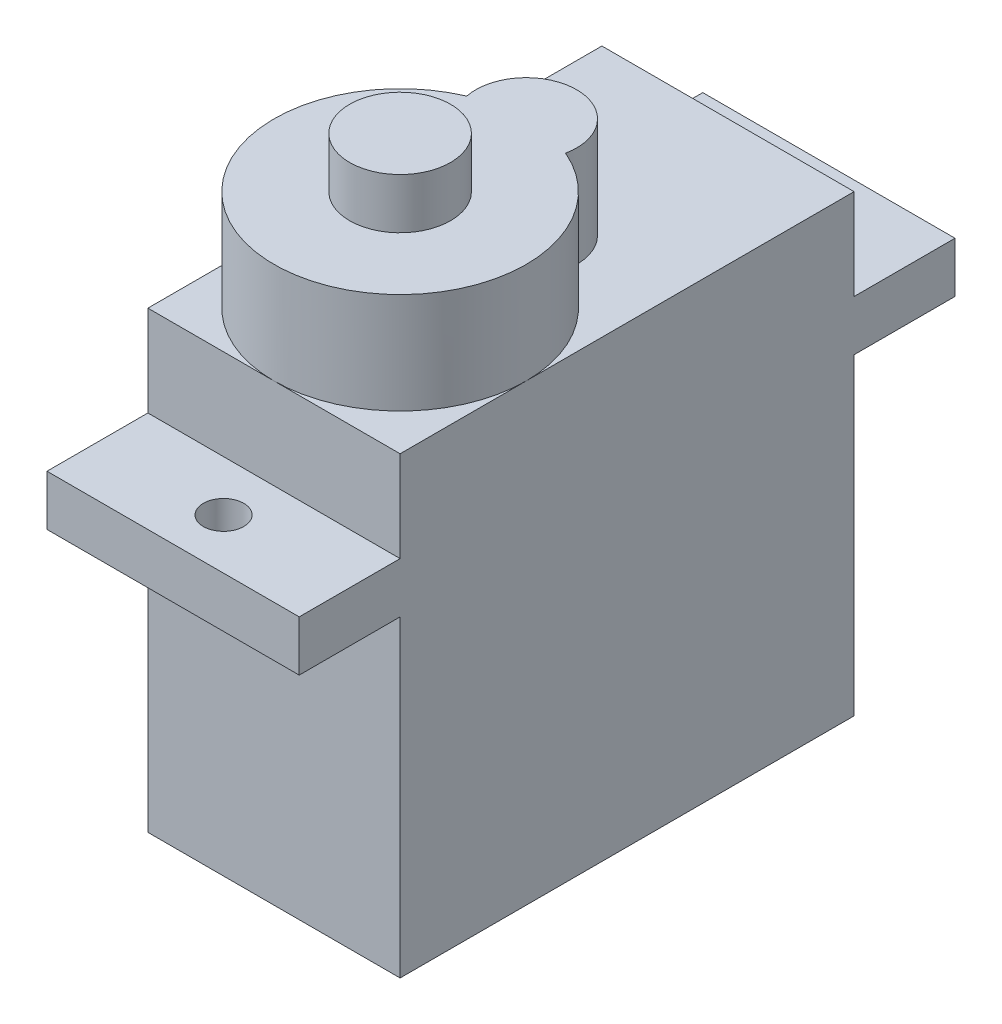
ISO-10303-21;
HEADER;
FILE_DESCRIPTION(('STEP AP214'),'2;1');
FILE_NAME('part.step','',(''),(''),'','','');
FILE_SCHEMA(('AUTOMOTIVE_DESIGN { 1 0 10303 214 1 1 1 1 }'));
ENDSEC;
DATA;
#1=APPLICATION_CONTEXT('core data for automotive mechanical design processes');
#2=APPLICATION_PROTOCOL_DEFINITION('international standard','automotive_design',2000,#1);
#3=PRODUCT_CONTEXT('',#1,'mechanical');
#4=PRODUCT('Part','Part','',(#3));
#5=PRODUCT_RELATED_PRODUCT_CATEGORY('part','',(#4));
#6=PRODUCT_DEFINITION_FORMATION('','',#4);
#7=PRODUCT_DEFINITION_CONTEXT('part definition',#1,'design');
#8=PRODUCT_DEFINITION('design','',#6,#7);
#9=PRODUCT_DEFINITION_SHAPE('','',#8);
#10=(LENGTH_UNIT() NAMED_UNIT(*) SI_UNIT(.MILLI.,.METRE.));
#11=(NAMED_UNIT(*) PLANE_ANGLE_UNIT() SI_UNIT($,.RADIAN.));
#12=(NAMED_UNIT(*) SI_UNIT($,.STERADIAN.) SOLID_ANGLE_UNIT());
#13=UNCERTAINTY_MEASURE_WITH_UNIT(LENGTH_MEASURE(1.E-05),#10,'distance_accuracy_value','');
#14=(GEOMETRIC_REPRESENTATION_CONTEXT(3) GLOBAL_UNCERTAINTY_ASSIGNED_CONTEXT((#13)) GLOBAL_UNIT_ASSIGNED_CONTEXT((#10,
#11,#12)) REPRESENTATION_CONTEXT('',''));
#15=CARTESIAN_POINT('',(0.,0.,0.));
#16=DIRECTION('',(0.,0.,1.));
#17=DIRECTION('',(1.,0.,0.));
#18=AXIS2_PLACEMENT_3D('',#15,#16,#17);
#19=CARTESIAN_POINT('',(6.25,27.5,13.125));
#20=DIRECTION('',(0.,1.,0.));
#21=DIRECTION('',(0.,0.,1.));
#22=AXIS2_PLACEMENT_3D('',#19,#20,#21);
#23=PLANE('',#22);
#24=CARTESIAN_POINT('',(6.25,27.5,10.));
#25=DIRECTION('',(0.,1.,0.));
#26=DIRECTION('',(0.,0.,1.));
#27=AXIS2_PLACEMENT_3D('',#24,#25,#26);
#28=CIRCLE('',#27,2.5);
#29=CARTESIAN_POINT('',(8.69948974278318,27.5,10.5));
#30=VERTEX_POINT('',#29);
#31=CARTESIAN_POINT('',(3.80051025721682,27.5,10.5));
#32=VERTEX_POINT('',#31);
#33=EDGE_CURVE('E155',#30,#32,#28,.T.);
#34=ORIENTED_EDGE('',*,*,#33,.T.);
#35=CARTESIAN_POINT('',(6.25,27.5,16.25));
#36=DIRECTION('',(0.,1.,0.));
#37=DIRECTION('',(0.,0.,1.));
#38=AXIS2_PLACEMENT_3D('',#35,#36,#37);
#39=CIRCLE('',#38,6.25);
#40=EDGE_CURVE('E145',#32,#30,#39,.T.);
#41=ORIENTED_EDGE('',*,*,#40,.T.);
#42=EDGE_LOOP('',(#34,#41));
#43=FACE_BOUND('',#42,.T.);
#44=CARTESIAN_POINT('',(6.25,27.5,16.25));
#45=DIRECTION('',(0.,1.,0.));
#46=DIRECTION('',(0.,0.,1.));
#47=AXIS2_PLACEMENT_3D('',#44,#45,#46);
#48=CIRCLE('',#47,2.5);
#49=CARTESIAN_POINT('',(6.25,27.5,18.75));
#50=VERTEX_POINT('',#49);
#51=EDGE_CURVE('E261',#50,#50,#48,.T.);
#52=ORIENTED_EDGE('',*,*,#51,.F.);
#53=EDGE_LOOP('',(#52));
#54=FACE_BOUND('',#53,.T.);
#55=ADVANCED_FACE('F34',(#43,#54),#23,.T.);
#56=CARTESIAN_POINT('',(0.,22.5,22.5));
#57=DIRECTION('',(0.,-1.,0.));
#58=DIRECTION('',(0.,0.,-1.));
#59=AXIS2_PLACEMENT_3D('',#56,#57,#58);
#60=PLANE('',#59);
#61=CARTESIAN_POINT('',(6.25,22.5,10.));
#62=DIRECTION('',(0.,1.,0.));
#63=DIRECTION('',(0.,0.,1.));
#64=AXIS2_PLACEMENT_3D('',#61,#62,#63);
#65=CIRCLE('',#64,2.5);
#66=CARTESIAN_POINT('',(8.69948974278318,22.5,10.5));
#67=VERTEX_POINT('',#66);
#68=CARTESIAN_POINT('',(3.80051025721682,22.5,10.5));
#69=VERTEX_POINT('',#68);
#70=EDGE_CURVE('E161',#67,#69,#65,.T.);
#71=ORIENTED_EDGE('',*,*,#70,.F.);
#72=CARTESIAN_POINT('',(6.25,22.5,16.25));
#73=DIRECTION('',(0.,1.,0.));
#74=DIRECTION('',(0.,0.,1.));
#75=AXIS2_PLACEMENT_3D('',#72,#73,#74);
#76=CIRCLE('',#75,6.25);
#77=CARTESIAN_POINT('',(12.5,22.5,16.25));
#78=VERTEX_POINT('',#77);
#79=EDGE_CURVE('E57',#78,#67,#76,.T.);
#80=ORIENTED_EDGE('',*,*,#79,.F.);
#81=DIRECTION('',(0.,0.,-1.));
#82=VECTOR('',#81,1.);
#83=CARTESIAN_POINT('',(12.5,22.5,22.5));
#84=LINE('',#83,#82);
#85=CARTESIAN_POINT('',(12.5,22.5,0.));
#86=VERTEX_POINT('',#85);
#87=EDGE_CURVE('E242',#78,#86,#84,.T.);
#88=ORIENTED_EDGE('',*,*,#87,.T.);
#89=DIRECTION('',(-1.,0.,0.));
#90=VECTOR('',#89,1.);
#91=CARTESIAN_POINT('',(0.,22.5,0.));
#92=LINE('',#91,#90);
#93=CARTESIAN_POINT('',(0.,22.5,0.));
#94=VERTEX_POINT('',#93);
#95=EDGE_CURVE('E236',#86,#94,#92,.T.);
#96=ORIENTED_EDGE('',*,*,#95,.T.);
#97=DIRECTION('',(0.,0.,-1.));
#98=VECTOR('',#97,1.);
#99=CARTESIAN_POINT('',(0.,22.5,22.5));
#100=LINE('',#99,#98);
#101=CARTESIAN_POINT('',(0.,22.5,16.25));
#102=VERTEX_POINT('',#101);
#103=EDGE_CURVE('E226',#102,#94,#100,.T.);
#104=ORIENTED_EDGE('',*,*,#103,.F.);
#105=EDGE_CURVE('E45',#69,#102,#76,.T.);
#106=ORIENTED_EDGE('',*,*,#105,.F.);
#107=EDGE_LOOP('',(#71,#80,#88,#96,#104,#106));
#108=FACE_BOUND('',#107,.T.);
#109=ADVANCED_FACE('F326',(#108),#60,.F.);
#110=CARTESIAN_POINT('',(6.25,22.5,22.5));
#111=VERTEX_POINT('',#110);
#112=EDGE_CURVE('E11',#102,#111,#76,.T.);
#113=ORIENTED_EDGE('',*,*,#112,.F.);
#114=CARTESIAN_POINT('',(0.,22.5,22.5));
#115=VERTEX_POINT('',#114);
#116=EDGE_CURVE('E239',#115,#102,#100,.T.);
#117=ORIENTED_EDGE('',*,*,#116,.F.);
#118=DIRECTION('',(-1.,0.,0.));
#119=VECTOR('',#118,1.);
#120=CARTESIAN_POINT('',(0.,22.5,22.5));
#121=LINE('',#120,#119);
#122=EDGE_CURVE('E222',#111,#115,#121,.T.);
#123=ORIENTED_EDGE('',*,*,#122,.F.);
#124=EDGE_LOOP('',(#113,#117,#123));
#125=FACE_BOUND('',#124,.T.);
#126=ADVANCED_FACE('F324',(#125),#60,.F.);
#127=EDGE_CURVE('E43',#111,#78,#76,.T.);
#128=ORIENTED_EDGE('',*,*,#127,.F.);
#129=CARTESIAN_POINT('',(12.5,22.5,22.5));
#130=VERTEX_POINT('',#129);
#131=EDGE_CURVE('E223',#130,#111,#121,.T.);
#132=ORIENTED_EDGE('',*,*,#131,.F.);
#133=EDGE_CURVE('E243',#130,#78,#84,.T.);
#134=ORIENTED_EDGE('',*,*,#133,.T.);
#135=EDGE_LOOP('',(#128,#132,#134));
#136=FACE_BOUND('',#135,.T.);
#137=ADVANCED_FACE('F334',(#136),#60,.F.);
#138=CARTESIAN_POINT('',(0.,0.,22.5));
#139=DIRECTION('',(0.,0.,-1.));
#140=DIRECTION('',(-1.,0.,0.));
#141=AXIS2_PLACEMENT_3D('',#138,#139,#140);
#142=PLANE('',#141);
#143=DIRECTION('',(0.,-1.,0.));
#144=VECTOR('',#143,1.);
#145=CARTESIAN_POINT('',(0.,0.,22.5));
#146=LINE('',#145,#144);
#147=CARTESIAN_POINT('',(0.,18.,22.5));
#148=VERTEX_POINT('',#147);
#149=EDGE_CURVE('E212',#115,#148,#146,.T.);
#150=ORIENTED_EDGE('',*,*,#149,.T.);
#151=DIRECTION('',(1.,0.,0.));
#152=VECTOR('',#151,1.);
#153=CARTESIAN_POINT('',(0.,18.,22.5));
#154=LINE('',#153,#152);
#155=CARTESIAN_POINT('',(12.5,18.,22.5));
#156=VERTEX_POINT('',#155);
#157=EDGE_CURVE('E208',#148,#156,#154,.T.);
#158=ORIENTED_EDGE('',*,*,#157,.T.);
#159=DIRECTION('',(0.,1.,0.));
#160=VECTOR('',#159,1.);
#161=CARTESIAN_POINT('',(12.5,0.,22.5));
#162=LINE('',#161,#160);
#163=EDGE_CURVE('E218',#156,#130,#162,.T.);
#164=ORIENTED_EDGE('',*,*,#163,.T.);
#165=ORIENTED_EDGE('',*,*,#131,.T.);
#166=ORIENTED_EDGE('',*,*,#122,.T.);
#167=EDGE_LOOP('',(#150,#158,#164,#165,#166));
#168=FACE_BOUND('',#167,.T.);
#169=ADVANCED_FACE('F318',(#168),#142,.F.);
#170=CARTESIAN_POINT('',(0.,0.,0.));
#171=DIRECTION('',(0.,0.,-1.));
#172=DIRECTION('',(-1.,0.,0.));
#173=AXIS2_PLACEMENT_3D('',#170,#171,#172);
#174=PLANE('',#173);
#175=DIRECTION('',(1.,0.,0.));
#176=VECTOR('',#175,1.);
#177=CARTESIAN_POINT('',(0.,18.,0.));
#178=LINE('',#177,#176);
#179=CARTESIAN_POINT('',(0.,18.,0.));
#180=VERTEX_POINT('',#179);
#181=CARTESIAN_POINT('',(12.5,18.,0.));
#182=VERTEX_POINT('',#181);
#183=EDGE_CURVE('E254',#180,#182,#178,.T.);
#184=ORIENTED_EDGE('',*,*,#183,.F.);
#185=DIRECTION('',(0.,-1.,0.));
#186=VECTOR('',#185,1.);
#187=CARTESIAN_POINT('',(0.,0.,0.));
#188=LINE('',#187,#186);
#189=EDGE_CURVE('E227',#94,#180,#188,.T.);
#190=ORIENTED_EDGE('',*,*,#189,.F.);
#191=ORIENTED_EDGE('',*,*,#95,.F.);
#192=DIRECTION('',(0.,1.,0.));
#193=VECTOR('',#192,1.);
#194=CARTESIAN_POINT('',(12.5,0.,0.));
#195=LINE('',#194,#193);
#196=EDGE_CURVE('E232',#182,#86,#195,.T.);
#197=ORIENTED_EDGE('',*,*,#196,.F.);
#198=EDGE_LOOP('',(#184,#190,#191,#197));
#199=FACE_BOUND('',#198,.T.);
#200=ADVANCED_FACE('F329',(#199),#174,.T.);
#201=CARTESIAN_POINT('',(0.,0.,22.5));
#202=DIRECTION('',(1.,0.,0.));
#203=DIRECTION('',(0.,0.,-1.));
#204=AXIS2_PLACEMENT_3D('',#201,#202,#203);
#205=PLANE('',#204);
#206=CARTESIAN_POINT('',(0.,15.5,22.5));
#207=VERTEX_POINT('',#206);
#208=CARTESIAN_POINT('',(0.,0.,22.5));
#209=VERTEX_POINT('',#208);
#210=EDGE_CURVE('E216',#207,#209,#146,.T.);
#211=ORIENTED_EDGE('',*,*,#210,.F.);
#212=DIRECTION('',(0.,0.,1.));
#213=VECTOR('',#212,1.);
#214=CARTESIAN_POINT('',(0.,15.5,-5.));
#215=LINE('',#214,#213);
#216=CARTESIAN_POINT('',(0.,15.5,27.5));
#217=VERTEX_POINT('',#216);
#218=EDGE_CURVE('E189',#207,#217,#215,.T.);
#219=ORIENTED_EDGE('',*,*,#218,.T.);
#220=DIRECTION('',(0.,-1.,0.));
#221=VECTOR('',#220,1.);
#222=CARTESIAN_POINT('',(0.,15.5,27.5));
#223=LINE('',#222,#221);
#224=CARTESIAN_POINT('',(0.,18.,27.5));
#225=VERTEX_POINT('',#224);
#226=EDGE_CURVE('E162',#225,#217,#223,.T.);
#227=ORIENTED_EDGE('',*,*,#226,.F.);
#228=DIRECTION('',(0.,0.,1.));
#229=VECTOR('',#228,1.);
#230=CARTESIAN_POINT('',(0.,18.,-5.));
#231=LINE('',#230,#229);
#232=EDGE_CURVE('E194',#148,#225,#231,.T.);
#233=ORIENTED_EDGE('',*,*,#232,.F.);
#234=ORIENTED_EDGE('',*,*,#149,.F.);
#235=ORIENTED_EDGE('',*,*,#116,.T.);
#236=ORIENTED_EDGE('',*,*,#103,.T.);
#237=ORIENTED_EDGE('',*,*,#189,.T.);
#238=CARTESIAN_POINT('',(0.,18.,-5.));
#239=VERTEX_POINT('',#238);
#240=EDGE_CURVE('E190',#239,#180,#231,.T.);
#241=ORIENTED_EDGE('',*,*,#240,.F.);
#242=DIRECTION('',(0.,-1.,0.));
#243=VECTOR('',#242,1.);
#244=CARTESIAN_POINT('',(0.,15.5,-5.));
#245=LINE('',#244,#243);
#246=CARTESIAN_POINT('',(0.,15.5,-5.));
#247=VERTEX_POINT('',#246);
#248=EDGE_CURVE('E177',#239,#247,#245,.T.);
#249=ORIENTED_EDGE('',*,*,#248,.T.);
#250=CARTESIAN_POINT('',(0.,15.5,0.));
#251=VERTEX_POINT('',#250);
#252=EDGE_CURVE('E203',#247,#251,#215,.T.);
#253=ORIENTED_EDGE('',*,*,#252,.T.);
#254=CARTESIAN_POINT('',(0.,0.,0.));
#255=VERTEX_POINT('',#254);
#256=EDGE_CURVE('E211',#251,#255,#188,.T.);
#257=ORIENTED_EDGE('',*,*,#256,.T.);
#258=DIRECTION('',(0.,0.,-1.));
#259=VECTOR('',#258,1.);
#260=CARTESIAN_POINT('',(0.,0.,22.5));
#261=LINE('',#260,#259);
#262=EDGE_CURVE('E249',#209,#255,#261,.T.);
#263=ORIENTED_EDGE('',*,*,#262,.F.);
#264=EDGE_LOOP('',(#211,#219,#227,#233,#234,#235,#236,#237,#241,#249,#253,#257,#263));
#265=FACE_BOUND('',#264,.T.);
#266=ADVANCED_FACE('F36',(#265),#205,.F.);
#267=CARTESIAN_POINT('',(0.,0.,22.5));
#268=DIRECTION('',(0.,1.,0.));
#269=DIRECTION('',(0.,0.,1.));
#270=AXIS2_PLACEMENT_3D('',#267,#268,#269);
#271=PLANE('',#270);
#272=DIRECTION('',(1.,0.,0.));
#273=VECTOR('',#272,1.);
#274=CARTESIAN_POINT('',(0.,0.,0.));
#275=LINE('',#274,#273);
#276=CARTESIAN_POINT('',(12.5,0.,0.));
#277=VERTEX_POINT('',#276);
#278=EDGE_CURVE('E230',#255,#277,#275,.T.);
#279=ORIENTED_EDGE('',*,*,#278,.T.);
#280=DIRECTION('',(0.,0.,-1.));
#281=VECTOR('',#280,1.);
#282=CARTESIAN_POINT('',(12.5,0.,22.5));
#283=LINE('',#282,#281);
#284=CARTESIAN_POINT('',(12.5,0.,22.5));
#285=VERTEX_POINT('',#284);
#286=EDGE_CURVE('E246',#285,#277,#283,.T.);
#287=ORIENTED_EDGE('',*,*,#286,.F.);
#288=DIRECTION('',(1.,0.,0.));
#289=VECTOR('',#288,1.);
#290=CARTESIAN_POINT('',(0.,0.,22.5));
#291=LINE('',#290,#289);
#292=EDGE_CURVE('E215',#209,#285,#291,.T.);
#293=ORIENTED_EDGE('',*,*,#292,.F.);
#294=ORIENTED_EDGE('',*,*,#262,.T.);
#295=EDGE_LOOP('',(#279,#287,#293,#294));
#296=FACE_BOUND('',#295,.T.);
#297=ADVANCED_FACE('F301',(#296),#271,.F.);
#298=CARTESIAN_POINT('',(12.5,0.,22.5));
#299=DIRECTION('',(-1.,0.,0.));
#300=DIRECTION('',(0.,0.,1.));
#301=AXIS2_PLACEMENT_3D('',#298,#299,#300);
#302=PLANE('',#301);
#303=CARTESIAN_POINT('',(12.5,15.5,0.));
#304=VERTEX_POINT('',#303);
#305=EDGE_CURVE('E233',#277,#304,#195,.T.);
#306=ORIENTED_EDGE('',*,*,#305,.T.);
#307=DIRECTION('',(0.,0.,1.));
#308=VECTOR('',#307,1.);
#309=CARTESIAN_POINT('',(12.5,15.5,-5.));
#310=LINE('',#309,#308);
#311=CARTESIAN_POINT('',(12.5,15.5,-5.));
#312=VERTEX_POINT('',#311);
#313=EDGE_CURVE('E199',#312,#304,#310,.T.);
#314=ORIENTED_EDGE('',*,*,#313,.F.);
#315=DIRECTION('',(0.,1.,0.));
#316=VECTOR('',#315,1.);
#317=CARTESIAN_POINT('',(12.5,15.5,-5.));
#318=LINE('',#317,#316);
#319=CARTESIAN_POINT('',(12.5,18.,-5.));
#320=VERTEX_POINT('',#319);
#321=EDGE_CURVE('E183',#312,#320,#318,.T.);
#322=ORIENTED_EDGE('',*,*,#321,.T.);
#323=DIRECTION('',(0.,0.,1.));
#324=VECTOR('',#323,1.);
#325=CARTESIAN_POINT('',(12.5,18.,-5.));
#326=LINE('',#325,#324);
#327=EDGE_CURVE('E195',#320,#182,#326,.T.);
#328=ORIENTED_EDGE('',*,*,#327,.T.);
#329=ORIENTED_EDGE('',*,*,#196,.T.);
#330=ORIENTED_EDGE('',*,*,#87,.F.);
#331=ORIENTED_EDGE('',*,*,#133,.F.);
#332=ORIENTED_EDGE('',*,*,#163,.F.);
#333=CARTESIAN_POINT('',(12.5,18.,27.5));
#334=VERTEX_POINT('',#333);
#335=EDGE_CURVE('E198',#156,#334,#326,.T.);
#336=ORIENTED_EDGE('',*,*,#335,.T.);
#337=DIRECTION('',(0.,1.,0.));
#338=VECTOR('',#337,1.);
#339=CARTESIAN_POINT('',(12.5,15.5,27.5));
#340=LINE('',#339,#338);
#341=CARTESIAN_POINT('',(12.5,15.5,27.5));
#342=VERTEX_POINT('',#341);
#343=EDGE_CURVE('E171',#342,#334,#340,.T.);
#344=ORIENTED_EDGE('',*,*,#343,.F.);
#345=CARTESIAN_POINT('',(12.5,15.5,22.5));
#346=VERTEX_POINT('',#345);
#347=EDGE_CURVE('E202',#346,#342,#310,.T.);
#348=ORIENTED_EDGE('',*,*,#347,.F.);
#349=EDGE_CURVE('E219',#285,#346,#162,.T.);
#350=ORIENTED_EDGE('',*,*,#349,.F.);
#351=ORIENTED_EDGE('',*,*,#286,.T.);
#352=EDGE_LOOP('',(#306,#314,#322,#328,#329,#330,#331,#332,#336,#344,#348,#350,#351));
#353=FACE_BOUND('',#352,.T.);
#354=ADVANCED_FACE('F331',(#353),#302,.F.);
#355=ORIENTED_EDGE('',*,*,#349,.T.);
#356=DIRECTION('',(-1.,0.,0.));
#357=VECTOR('',#356,1.);
#358=CARTESIAN_POINT('',(0.,15.5,22.5));
#359=LINE('',#358,#357);
#360=EDGE_CURVE('E193',#346,#207,#359,.T.);
#361=ORIENTED_EDGE('',*,*,#360,.T.);
#362=ORIENTED_EDGE('',*,*,#210,.T.);
#363=ORIENTED_EDGE('',*,*,#292,.T.);
#364=EDGE_LOOP('',(#355,#361,#362,#363));
#365=FACE_BOUND('',#364,.T.);
#366=ADVANCED_FACE('F304',(#365),#142,.F.);
#367=DIRECTION('',(-1.,0.,0.));
#368=VECTOR('',#367,1.);
#369=CARTESIAN_POINT('',(0.,15.5,0.));
#370=LINE('',#369,#368);
#371=EDGE_CURVE('E252',#304,#251,#370,.T.);
#372=ORIENTED_EDGE('',*,*,#371,.F.);
#373=ORIENTED_EDGE('',*,*,#305,.F.);
#374=ORIENTED_EDGE('',*,*,#278,.F.);
#375=ORIENTED_EDGE('',*,*,#256,.F.);
#376=EDGE_LOOP('',(#372,#373,#374,#375));
#377=FACE_BOUND('',#376,.T.);
#378=ADVANCED_FACE('F297',(#377),#174,.T.);
#379=CARTESIAN_POINT('',(0.,0.,-5.));
#380=DIRECTION('',(0.,0.,-1.));
#381=DIRECTION('',(-1.,0.,0.));
#382=AXIS2_PLACEMENT_3D('',#379,#380,#381);
#383=PLANE('',#382);
#384=ORIENTED_EDGE('',*,*,#248,.F.);
#385=DIRECTION('',(-1.,0.,0.));
#386=VECTOR('',#385,1.);
#387=CARTESIAN_POINT('',(0.,18.,-5.));
#388=LINE('',#387,#386);
#389=EDGE_CURVE('E186',#320,#239,#388,.T.);
#390=ORIENTED_EDGE('',*,*,#389,.F.);
#391=ORIENTED_EDGE('',*,*,#321,.F.);
#392=DIRECTION('',(1.,0.,0.));
#393=VECTOR('',#392,1.);
#394=CARTESIAN_POINT('',(0.,15.5,-5.));
#395=LINE('',#394,#393);
#396=EDGE_CURVE('E180',#247,#312,#395,.T.);
#397=ORIENTED_EDGE('',*,*,#396,.F.);
#398=EDGE_LOOP('',(#384,#390,#391,#397));
#399=FACE_BOUND('',#398,.T.);
#400=ADVANCED_FACE('F290',(#399),#383,.T.);
#401=CARTESIAN_POINT('',(0.,15.5,-5.));
#402=DIRECTION('',(0.,-1.,0.));
#403=DIRECTION('',(0.,0.,-1.));
#404=AXIS2_PLACEMENT_3D('',#401,#402,#403);
#405=PLANE('',#404);
#406=CARTESIAN_POINT('',(6.25,15.5,-2.5));
#407=DIRECTION('',(0.,-1.,0.));
#408=DIRECTION('',(0.,0.,-1.));
#409=AXIS2_PLACEMENT_3D('',#406,#407,#408);
#410=CIRCLE('',#409,1.);
#411=CARTESIAN_POINT('',(6.25,15.5,-3.5));
#412=VERTEX_POINT('',#411);
#413=EDGE_CURVE('E269',#412,#412,#410,.T.);
#414=ORIENTED_EDGE('',*,*,#413,.F.);
#415=EDGE_LOOP('',(#414));
#416=FACE_BOUND('',#415,.T.);
#417=ORIENTED_EDGE('',*,*,#313,.T.);
#418=ORIENTED_EDGE('',*,*,#371,.T.);
#419=ORIENTED_EDGE('',*,*,#252,.F.);
#420=ORIENTED_EDGE('',*,*,#396,.T.);
#421=EDGE_LOOP('',(#417,#418,#419,#420));
#422=FACE_BOUND('',#421,.T.);
#423=ADVANCED_FACE('F281',(#416,#422),#405,.T.);
#424=CARTESIAN_POINT('',(0.,18.,-5.));
#425=DIRECTION('',(0.,1.,0.));
#426=DIRECTION('',(0.,0.,1.));
#427=AXIS2_PLACEMENT_3D('',#424,#425,#426);
#428=PLANE('',#427);
#429=CARTESIAN_POINT('',(6.25,18.,-2.5));
#430=DIRECTION('',(0.,1.,0.));
#431=DIRECTION('',(0.,0.,1.));
#432=AXIS2_PLACEMENT_3D('',#429,#430,#431);
#433=CIRCLE('',#432,1.);
#434=CARTESIAN_POINT('',(6.25,18.,-1.5));
#435=VERTEX_POINT('',#434);
#436=EDGE_CURVE('E272',#435,#435,#433,.T.);
#437=ORIENTED_EDGE('',*,*,#436,.F.);
#438=EDGE_LOOP('',(#437));
#439=FACE_BOUND('',#438,.T.);
#440=ORIENTED_EDGE('',*,*,#240,.T.);
#441=ORIENTED_EDGE('',*,*,#183,.T.);
#442=ORIENTED_EDGE('',*,*,#327,.F.);
#443=ORIENTED_EDGE('',*,*,#389,.T.);
#444=EDGE_LOOP('',(#440,#441,#442,#443));
#445=FACE_BOUND('',#444,.T.);
#446=ADVANCED_FACE('F278',(#439,#445),#428,.T.);
#447=CARTESIAN_POINT('',(6.25,18.,25.));
#448=DIRECTION('',(0.,1.,0.));
#449=DIRECTION('',(0.,0.,1.));
#450=AXIS2_PLACEMENT_3D('',#447,#448,#449);
#451=CIRCLE('',#450,1.);
#452=CARTESIAN_POINT('',(6.25,18.,26.));
#453=VERTEX_POINT('',#452);
#454=EDGE_CURVE('E266',#453,#453,#451,.T.);
#455=ORIENTED_EDGE('',*,*,#454,.F.);
#456=EDGE_LOOP('',(#455));
#457=FACE_BOUND('',#456,.T.);
#458=ORIENTED_EDGE('',*,*,#157,.F.);
#459=ORIENTED_EDGE('',*,*,#232,.T.);
#460=DIRECTION('',(-1.,0.,0.));
#461=VECTOR('',#460,1.);
#462=CARTESIAN_POINT('',(0.,18.,27.5));
#463=LINE('',#462,#461);
#464=EDGE_CURVE('E174',#334,#225,#463,.T.);
#465=ORIENTED_EDGE('',*,*,#464,.F.);
#466=ORIENTED_EDGE('',*,*,#335,.F.);
#467=EDGE_LOOP('',(#458,#459,#465,#466));
#468=FACE_BOUND('',#467,.T.);
#469=ADVANCED_FACE('F280',(#457,#468),#428,.T.);
#470=CARTESIAN_POINT('',(6.25,15.5,25.));
#471=DIRECTION('',(0.,-1.,0.));
#472=DIRECTION('',(0.,0.,-1.));
#473=AXIS2_PLACEMENT_3D('',#470,#471,#472);
#474=CIRCLE('',#473,1.);
#475=CARTESIAN_POINT('',(6.25,15.5,24.));
#476=VERTEX_POINT('',#475);
#477=EDGE_CURVE('E38',#476,#476,#474,.T.);
#478=ORIENTED_EDGE('',*,*,#477,.F.);
#479=EDGE_LOOP('',(#478));
#480=FACE_BOUND('',#479,.T.);
#481=ORIENTED_EDGE('',*,*,#360,.F.);
#482=ORIENTED_EDGE('',*,*,#347,.T.);
#483=DIRECTION('',(1.,0.,0.));
#484=VECTOR('',#483,1.);
#485=CARTESIAN_POINT('',(0.,15.5,27.5));
#486=LINE('',#485,#484);
#487=EDGE_CURVE('E165',#217,#342,#486,.T.);
#488=ORIENTED_EDGE('',*,*,#487,.F.);
#489=ORIENTED_EDGE('',*,*,#218,.F.);
#490=EDGE_LOOP('',(#481,#482,#488,#489));
#491=FACE_BOUND('',#490,.T.);
#492=ADVANCED_FACE('F309',(#480,#491),#405,.T.);
#493=CARTESIAN_POINT('',(0.,0.,27.5));
#494=DIRECTION('',(0.,0.,-1.));
#495=DIRECTION('',(-1.,0.,0.));
#496=AXIS2_PLACEMENT_3D('',#493,#494,#495);
#497=PLANE('',#496);
#498=ORIENTED_EDGE('',*,*,#226,.T.);
#499=ORIENTED_EDGE('',*,*,#487,.T.);
#500=ORIENTED_EDGE('',*,*,#343,.T.);
#501=ORIENTED_EDGE('',*,*,#464,.T.);
#502=EDGE_LOOP('',(#498,#499,#500,#501));
#503=FACE_BOUND('',#502,.T.);
#504=ADVANCED_FACE('F313',(#503),#497,.F.);
#505=CARTESIAN_POINT('',(6.25,27.5,10.));
#506=DIRECTION('',(0.,-1.,0.));
#507=DIRECTION('',(0.,0.,-1.));
#508=AXIS2_PLACEMENT_3D('',#505,#506,#507);
#509=CYLINDRICAL_SURFACE('',#508,2.5);
#510=ORIENTED_EDGE('',*,*,#70,.T.);
#511=DIRECTION('',(0.,-1.,0.));
#512=VECTOR('',#511,1.);
#513=CARTESIAN_POINT('',(3.80051025721682,27.5,10.5));
#514=LINE('',#513,#512);
#515=EDGE_CURVE('E149',#32,#69,#514,.T.);
#516=ORIENTED_EDGE('',*,*,#515,.F.);
#517=ORIENTED_EDGE('',*,*,#33,.F.);
#518=DIRECTION('',(0.,-1.,0.));
#519=VECTOR('',#518,1.);
#520=CARTESIAN_POINT('',(8.69948974278318,27.5,10.5));
#521=LINE('',#520,#519);
#522=EDGE_CURVE('E152',#30,#67,#521,.T.);
#523=ORIENTED_EDGE('',*,*,#522,.T.);
#524=EDGE_LOOP('',(#510,#516,#517,#523));
#525=FACE_BOUND('',#524,.T.);
#526=ADVANCED_FACE('F160',(#525),#509,.T.);
#527=CARTESIAN_POINT('',(6.25,27.5,16.25));
#528=DIRECTION('',(0.,-1.,0.));
#529=DIRECTION('',(0.,0.,-1.));
#530=AXIS2_PLACEMENT_3D('',#527,#528,#529);
#531=CYLINDRICAL_SURFACE('',#530,6.25);
#532=ORIENTED_EDGE('',*,*,#105,.T.);
#533=ORIENTED_EDGE('',*,*,#112,.T.);
#534=ORIENTED_EDGE('',*,*,#127,.T.);
#535=ORIENTED_EDGE('',*,*,#79,.T.);
#536=ORIENTED_EDGE('',*,*,#522,.F.);
#537=ORIENTED_EDGE('',*,*,#40,.F.);
#538=ORIENTED_EDGE('',*,*,#515,.T.);
#539=EDGE_LOOP('',(#532,#533,#534,#535,#536,#537,#538));
#540=FACE_BOUND('',#539,.T.);
#541=ADVANCED_FACE('F147',(#540),#531,.T.);
#542=CARTESIAN_POINT('',(6.25,30.,16.25));
#543=DIRECTION('',(0.,-1.,0.));
#544=DIRECTION('',(0.,0.,-1.));
#545=AXIS2_PLACEMENT_3D('',#542,#543,#544);
#546=CYLINDRICAL_SURFACE('',#545,2.5);
#547=CARTESIAN_POINT('',(6.25,30.,16.25));
#548=DIRECTION('',(0.,1.,0.));
#549=DIRECTION('',(0.,0.,1.));
#550=AXIS2_PLACEMENT_3D('',#547,#548,#549);
#551=CIRCLE('',#550,2.5);
#552=CARTESIAN_POINT('',(6.25,30.,18.75));
#553=VERTEX_POINT('',#552);
#554=EDGE_CURVE('E259',#553,#553,#551,.T.);
#555=ORIENTED_EDGE('',*,*,#554,.F.);
#556=EDGE_LOOP('',(#555));
#557=FACE_BOUND('',#556,.T.);
#558=ORIENTED_EDGE('',*,*,#51,.T.);
#559=EDGE_LOOP('',(#558));
#560=FACE_BOUND('',#559,.T.);
#561=ADVANCED_FACE('F351',(#557,#560),#546,.T.);
#562=CARTESIAN_POINT('',(6.25,30.,16.25));
#563=DIRECTION('',(0.,1.,0.));
#564=DIRECTION('',(0.,0.,1.));
#565=AXIS2_PLACEMENT_3D('',#562,#563,#564);
#566=PLANE('',#565);
#567=ORIENTED_EDGE('',*,*,#554,.T.);
#568=EDGE_LOOP('',(#567));
#569=FACE_BOUND('',#568,.T.);
#570=ADVANCED_FACE('F468',(#569),#566,.T.);
#571=CARTESIAN_POINT('',(6.25,0.,25.));
#572=DIRECTION('',(0.,1.,0.));
#573=DIRECTION('',(0.,0.,1.));
#574=AXIS2_PLACEMENT_3D('',#571,#572,#573);
#575=CYLINDRICAL_SURFACE('',#574,1.);
#576=ORIENTED_EDGE('',*,*,#477,.T.);
#577=EDGE_LOOP('',(#576));
#578=FACE_BOUND('',#577,.T.);
#579=ORIENTED_EDGE('',*,*,#454,.T.);
#580=EDGE_LOOP('',(#579));
#581=FACE_BOUND('',#580,.T.);
#582=ADVANCED_FACE('F476',(#578,#581),#575,.F.);
#583=CARTESIAN_POINT('',(6.25,0.,-2.5));
#584=DIRECTION('',(0.,1.,0.));
#585=DIRECTION('',(0.,0.,1.));
#586=AXIS2_PLACEMENT_3D('',#583,#584,#585);
#587=CYLINDRICAL_SURFACE('',#586,1.);
#588=ORIENTED_EDGE('',*,*,#413,.T.);
#589=EDGE_LOOP('',(#588));
#590=FACE_BOUND('',#589,.T.);
#591=ORIENTED_EDGE('',*,*,#436,.T.);
#592=EDGE_LOOP('',(#591));
#593=FACE_BOUND('',#592,.T.);
#594=ADVANCED_FACE('F276',(#590,#593),#587,.F.);
#595=CLOSED_SHELL('',(#55,#109,#126,#137,#169,#200,#266,#297,#354,#366,#378,#400,#423,#446,#469,
#492,#504,#526,#541,#561,#570,#582,#594));
#596=MANIFOLD_SOLID_BREP('B2',#595);
#597=ADVANCED_BREP_SHAPE_REPRESENTATION('',(#18,#596),#14);
#598=SHAPE_DEFINITION_REPRESENTATION(#9,#597);
ENDSEC;
END-ISO-10303-21;
